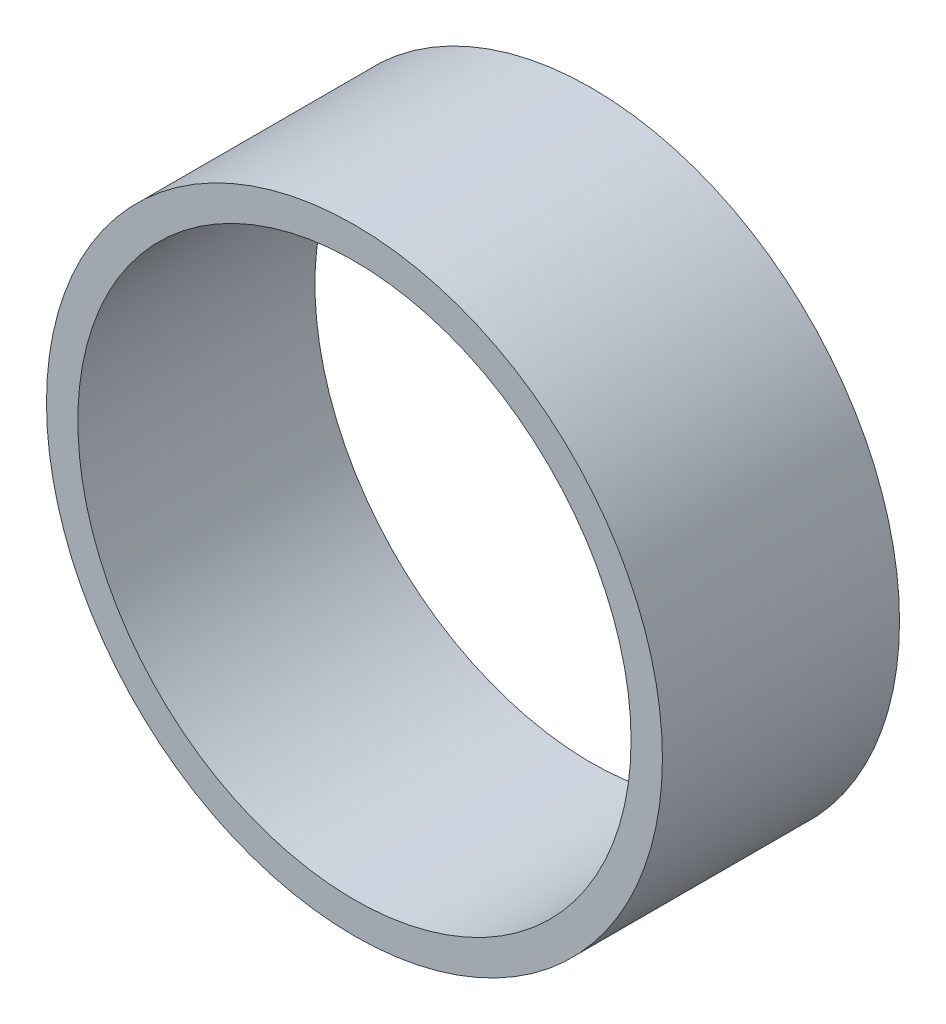
ISO-10303-21;
HEADER;
FILE_DESCRIPTION(('STEP AP214'),'2;1');
FILE_NAME('part.step','',(''),(''),'','','');
FILE_SCHEMA(('AUTOMOTIVE_DESIGN { 1 0 10303 214 1 1 1 1 }'));
ENDSEC;
DATA;
#1=APPLICATION_CONTEXT('core data for automotive mechanical design processes');
#2=APPLICATION_PROTOCOL_DEFINITION('international standard','automotive_design',2000,#1);
#3=PRODUCT_CONTEXT('',#1,'mechanical');
#4=PRODUCT('Part','Part','',(#3));
#5=PRODUCT_RELATED_PRODUCT_CATEGORY('part','',(#4));
#6=PRODUCT_DEFINITION_FORMATION('','',#4);
#7=PRODUCT_DEFINITION_CONTEXT('part definition',#1,'design');
#8=PRODUCT_DEFINITION('design','',#6,#7);
#9=PRODUCT_DEFINITION_SHAPE('','',#8);
#10=(LENGTH_UNIT() NAMED_UNIT(*) SI_UNIT(.MILLI.,.METRE.));
#11=(NAMED_UNIT(*) PLANE_ANGLE_UNIT() SI_UNIT($,.RADIAN.));
#12=(NAMED_UNIT(*) SI_UNIT($,.STERADIAN.) SOLID_ANGLE_UNIT());
#13=UNCERTAINTY_MEASURE_WITH_UNIT(LENGTH_MEASURE(1.E-05),#10,'distance_accuracy_value','');
#14=(GEOMETRIC_REPRESENTATION_CONTEXT(3) GLOBAL_UNCERTAINTY_ASSIGNED_CONTEXT((#13)) GLOBAL_UNIT_ASSIGNED_CONTEXT((#10,
#11,#12)) REPRESENTATION_CONTEXT('',''));
#15=CARTESIAN_POINT('',(0.,0.,0.));
#16=DIRECTION('',(0.,0.,1.));
#17=DIRECTION('',(1.,0.,0.));
#18=AXIS2_PLACEMENT_3D('',#15,#16,#17);
#19=CARTESIAN_POINT('',(0.,0.,11.43));
#20=DIRECTION('',(0.,0.,1.));
#21=DIRECTION('',(1.,0.,0.));
#22=AXIS2_PLACEMENT_3D('',#19,#20,#21);
#23=PLANE('',#22);
#24=CARTESIAN_POINT('',(0.,0.,11.43));
#25=DIRECTION('',(0.,0.,1.));
#26=DIRECTION('',(1.,0.,0.));
#27=AXIS2_PLACEMENT_3D('',#24,#25,#26);
#28=CIRCLE('',#27,14.8463);
#29=CARTESIAN_POINT('',(14.8463,0.,11.43));
#30=VERTEX_POINT('',#29);
#31=EDGE_CURVE('E10',#30,#30,#28,.T.);
#32=ORIENTED_EDGE('',*,*,#31,.T.);
#33=EDGE_LOOP('',(#32));
#34=FACE_BOUND('',#33,.T.);
#35=CARTESIAN_POINT('',(0.,0.,11.43));
#36=DIRECTION('',(0.,0.,1.));
#37=DIRECTION('',(1.,0.,0.));
#38=AXIS2_PLACEMENT_3D('',#35,#36,#37);
#39=CIRCLE('',#38,13.335);
#40=CARTESIAN_POINT('',(13.335,0.,11.43));
#41=VERTEX_POINT('',#40);
#42=EDGE_CURVE('E48',#41,#41,#39,.T.);
#43=ORIENTED_EDGE('',*,*,#42,.F.);
#44=EDGE_LOOP('',(#43));
#45=FACE_BOUND('',#44,.T.);
#46=ADVANCED_FACE('F37',(#34,#45),#23,.T.);
#47=CARTESIAN_POINT('',(0.,0.,0.));
#48=DIRECTION('',(0.,0.,1.));
#49=DIRECTION('',(1.,0.,0.));
#50=AXIS2_PLACEMENT_3D('',#47,#48,#49);
#51=PLANE('',#50);
#52=CARTESIAN_POINT('',(0.,0.,0.));
#53=DIRECTION('',(0.,0.,1.));
#54=DIRECTION('',(1.,0.,0.));
#55=AXIS2_PLACEMENT_3D('',#52,#53,#54);
#56=CIRCLE('',#55,14.8463);
#57=CARTESIAN_POINT('',(14.8463,0.,0.));
#58=VERTEX_POINT('',#57);
#59=EDGE_CURVE('E41',#58,#58,#56,.T.);
#60=ORIENTED_EDGE('',*,*,#59,.F.);
#61=EDGE_LOOP('',(#60));
#62=FACE_BOUND('',#61,.T.);
#63=CARTESIAN_POINT('',(0.,0.,0.));
#64=DIRECTION('',(0.,0.,1.));
#65=DIRECTION('',(1.,0.,0.));
#66=AXIS2_PLACEMENT_3D('',#63,#64,#65);
#67=CIRCLE('',#66,13.335);
#68=CARTESIAN_POINT('',(13.335,0.,0.));
#69=VERTEX_POINT('',#68);
#70=EDGE_CURVE('E50',#69,#69,#67,.T.);
#71=ORIENTED_EDGE('',*,*,#70,.T.);
#72=EDGE_LOOP('',(#71));
#73=FACE_BOUND('',#72,.T.);
#74=ADVANCED_FACE('F60',(#62,#73),#51,.F.);
#75=CARTESIAN_POINT('',(0.,0.,11.43));
#76=DIRECTION('',(0.,0.,-1.));
#77=DIRECTION('',(-1.,0.,0.));
#78=AXIS2_PLACEMENT_3D('',#75,#76,#77);
#79=CYLINDRICAL_SURFACE('',#78,14.8463);
#80=ORIENTED_EDGE('',*,*,#31,.F.);
#81=EDGE_LOOP('',(#80));
#82=FACE_BOUND('',#81,.T.);
#83=ORIENTED_EDGE('',*,*,#59,.T.);
#84=EDGE_LOOP('',(#83));
#85=FACE_BOUND('',#84,.T.);
#86=ADVANCED_FACE('F39',(#82,#85),#79,.T.);
#87=CARTESIAN_POINT('',(0.,0.,11.43));
#88=DIRECTION('',(0.,0.,-1.));
#89=DIRECTION('',(-1.,0.,0.));
#90=AXIS2_PLACEMENT_3D('',#87,#88,#89);
#91=CYLINDRICAL_SURFACE('',#90,13.335);
#92=ORIENTED_EDGE('',*,*,#42,.T.);
#93=EDGE_LOOP('',(#92));
#94=FACE_BOUND('',#93,.T.);
#95=ORIENTED_EDGE('',*,*,#70,.F.);
#96=EDGE_LOOP('',(#95));
#97=FACE_BOUND('',#96,.T.);
#98=ADVANCED_FACE('F56',(#94,#97),#91,.F.);
#99=CLOSED_SHELL('',(#46,#74,#86,#98));
#100=MANIFOLD_SOLID_BREP('B2',#99);
#101=ADVANCED_BREP_SHAPE_REPRESENTATION('',(#18,#100),#14);
#102=SHAPE_DEFINITION_REPRESENTATION(#9,#101);
ENDSEC;
END-ISO-10303-21;
